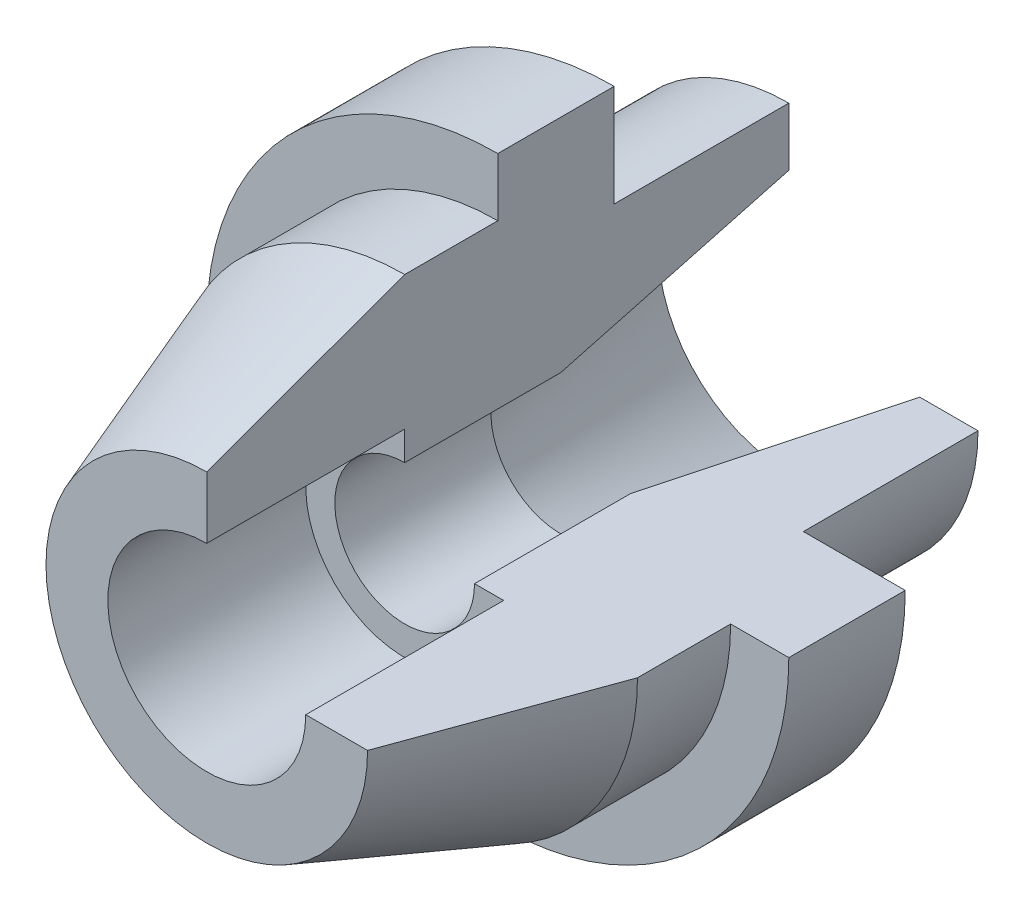
ISO-10303-21;
HEADER;
FILE_DESCRIPTION(('STEP AP214'),'2;1');
FILE_NAME('part.step','',(''),(''),'','','');
FILE_SCHEMA(('AUTOMOTIVE_DESIGN { 1 0 10303 214 1 1 1 1 }'));
ENDSEC;
DATA;
#1=APPLICATION_CONTEXT('core data for automotive mechanical design processes');
#2=APPLICATION_PROTOCOL_DEFINITION('international standard','automotive_design',2000,#1);
#3=PRODUCT_CONTEXT('',#1,'mechanical');
#4=PRODUCT('Part','Part','',(#3));
#5=PRODUCT_RELATED_PRODUCT_CATEGORY('part','',(#4));
#6=PRODUCT_DEFINITION_FORMATION('','',#4);
#7=PRODUCT_DEFINITION_CONTEXT('part definition',#1,'design');
#8=PRODUCT_DEFINITION('design','',#6,#7);
#9=PRODUCT_DEFINITION_SHAPE('','',#8);
#10=(LENGTH_UNIT() NAMED_UNIT(*) SI_UNIT(.MILLI.,.METRE.));
#11=(NAMED_UNIT(*) PLANE_ANGLE_UNIT() SI_UNIT($,.RADIAN.));
#12=(NAMED_UNIT(*) SI_UNIT($,.STERADIAN.) SOLID_ANGLE_UNIT());
#13=UNCERTAINTY_MEASURE_WITH_UNIT(LENGTH_MEASURE(1.E-05),#10,'distance_accuracy_value','');
#14=(GEOMETRIC_REPRESENTATION_CONTEXT(3) GLOBAL_UNCERTAINTY_ASSIGNED_CONTEXT((#13)) GLOBAL_UNIT_ASSIGNED_CONTEXT((#10,
#11,#12)) REPRESENTATION_CONTEXT('',''));
#15=CARTESIAN_POINT('',(0.,0.,0.));
#16=DIRECTION('',(0.,0.,1.));
#17=DIRECTION('',(1.,0.,0.));
#18=AXIS2_PLACEMENT_3D('',#15,#16,#17);
#19=CARTESIAN_POINT('',(0.,0.,0.));
#20=DIRECTION('',(0.,0.,-1.));
#21=DIRECTION('',(-1.,0.,0.));
#22=AXIS2_PLACEMENT_3D('',#19,#20,#21);
#23=CYLINDRICAL_SURFACE('',#22,17.);
#24=CARTESIAN_POINT('',(0.,0.,0.));
#25=DIRECTION('',(0.,0.,-1.));
#26=DIRECTION('',(-1.,0.,0.));
#27=AXIS2_PLACEMENT_3D('',#24,#25,#26);
#28=CIRCLE('',#27,17.);
#29=CARTESIAN_POINT('',(17.,1.78065548281E-13,0.));
#30=VERTEX_POINT('',#29);
#31=CARTESIAN_POINT('',(0.,17.,0.));
#32=VERTEX_POINT('',#31);
#33=EDGE_CURVE('E11',#30,#32,#28,.T.);
#34=ORIENTED_EDGE('',*,*,#33,.F.);
#35=DIRECTION('',(0.,0.,-1.));
#36=VECTOR('',#35,1.);
#37=CARTESIAN_POINT('',(17.,1.78065548281E-13,-34.));
#38=LINE('',#37,#36);
#39=CARTESIAN_POINT('',(17.,1.78065548281E-13,-34.));
#40=VERTEX_POINT('',#39);
#41=EDGE_CURVE('E128',#30,#40,#38,.T.);
#42=ORIENTED_EDGE('',*,*,#41,.T.);
#43=CARTESIAN_POINT('',(0.,0.,-34.));
#44=DIRECTION('',(0.,0.,-1.));
#45=DIRECTION('',(-1.,0.,0.));
#46=AXIS2_PLACEMENT_3D('',#43,#44,#45);
#47=CIRCLE('',#46,17.);
#48=CARTESIAN_POINT('',(0.,17.,-34.));
#49=VERTEX_POINT('',#48);
#50=EDGE_CURVE('E123',#40,#49,#47,.T.);
#51=ORIENTED_EDGE('',*,*,#50,.T.);
#52=DIRECTION('',(0.,0.,-1.));
#53=VECTOR('',#52,1.);
#54=CARTESIAN_POINT('',(0.,17.,-34.));
#55=LINE('',#54,#53);
#56=EDGE_CURVE('E126',#32,#49,#55,.T.);
#57=ORIENTED_EDGE('',*,*,#56,.F.);
#58=EDGE_LOOP('',(#34,#42,#51,#57));
#59=FACE_BOUND('',#58,.T.);
#60=ADVANCED_FACE('F39',(#59),#23,.F.);
#61=CARTESIAN_POINT('',(17.,1.78065548281E-13,0.));
#62=DIRECTION('',(0.,0.,1.));
#63=DIRECTION('',(1.,0.,0.));
#64=AXIS2_PLACEMENT_3D('',#61,#62,#63);
#65=PLANE('',#64);
#66=CARTESIAN_POINT('',(0.,0.,0.));
#67=DIRECTION('',(0.,0.,-1.));
#68=DIRECTION('',(-1.,0.,0.));
#69=AXIS2_PLACEMENT_3D('',#66,#67,#68);
#70=CIRCLE('',#69,27.6250120349492);
#71=CARTESIAN_POINT('',(27.6250120349492,2.89356642016027E-13,0.));
#72=VERTEX_POINT('',#71);
#73=CARTESIAN_POINT('',(0.,27.6250120349492,0.));
#74=VERTEX_POINT('',#73);
#75=EDGE_CURVE('E47',#72,#74,#70,.T.);
#76=ORIENTED_EDGE('',*,*,#75,.F.);
#77=DIRECTION('',(-1.,0.,0.));
#78=VECTOR('',#77,1.);
#79=CARTESIAN_POINT('',(17.,1.78065548281E-13,0.));
#80=LINE('',#79,#78);
#81=EDGE_CURVE('E133',#72,#30,#80,.T.);
#82=ORIENTED_EDGE('',*,*,#81,.T.);
#83=ORIENTED_EDGE('',*,*,#33,.T.);
#84=DIRECTION('',(0.,-1.,0.));
#85=VECTOR('',#84,1.);
#86=CARTESIAN_POINT('',(0.,17.,0.));
#87=LINE('',#86,#85);
#88=EDGE_CURVE('E146',#74,#32,#87,.T.);
#89=ORIENTED_EDGE('',*,*,#88,.F.);
#90=EDGE_LOOP('',(#76,#82,#83,#89));
#91=FACE_BOUND('',#90,.T.);
#92=ADVANCED_FACE('F41',(#91),#65,.T.);
#93=CARTESIAN_POINT('',(0.,0.,-34.));
#94=DIRECTION('',(0.,0.,-1.));
#95=DIRECTION('',(-1.,0.,0.));
#96=AXIS2_PLACEMENT_3D('',#93,#94,#95);
#97=CONICAL_SURFACE('',#96,40.,0.349065850398863);
#98=CARTESIAN_POINT('',(0.,0.,-34.));
#99=DIRECTION('',(0.,0.,-1.));
#100=DIRECTION('',(-1.,0.,0.));
#101=AXIS2_PLACEMENT_3D('',#98,#99,#100);
#102=CIRCLE('',#101,40.);
#103=CARTESIAN_POINT('',(40.,4.18977760661176E-13,-34.));
#104=VERTEX_POINT('',#103);
#105=CARTESIAN_POINT('',(0.,40.,-34.));
#106=VERTEX_POINT('',#105);
#107=EDGE_CURVE('E219',#104,#106,#102,.T.);
#108=ORIENTED_EDGE('',*,*,#107,.F.);
#109=DIRECTION('',(-0.342020143325666,0.,0.939692620785909));
#110=VECTOR('',#109,1.);
#111=CARTESIAN_POINT('',(27.6250120349492,2.89356642016027E-13,0.));
#112=LINE('',#111,#110);
#113=EDGE_CURVE('E201',#104,#72,#112,.T.);
#114=ORIENTED_EDGE('',*,*,#113,.T.);
#115=ORIENTED_EDGE('',*,*,#75,.T.);
#116=DIRECTION('',(0.,-0.342020143325666,0.939692620785909));
#117=VECTOR('',#116,1.);
#118=CARTESIAN_POINT('',(0.,27.6250120349492,0.));
#119=LINE('',#118,#117);
#120=EDGE_CURVE('E171',#106,#74,#119,.T.);
#121=ORIENTED_EDGE('',*,*,#120,.F.);
#122=EDGE_LOOP('',(#108,#114,#115,#121));
#123=FACE_BOUND('',#122,.T.);
#124=ADVANCED_FACE('F222',(#123),#97,.T.);
#125=CARTESIAN_POINT('',(0.,0.,0.));
#126=DIRECTION('',(0.,0.,-1.));
#127=DIRECTION('',(-1.,0.,0.));
#128=AXIS2_PLACEMENT_3D('',#125,#126,#127);
#129=CYLINDRICAL_SURFACE('',#128,40.);
#130=CARTESIAN_POINT('',(0.,0.,-50.));
#131=DIRECTION('',(0.,0.,-1.));
#132=DIRECTION('',(-1.,0.,0.));
#133=AXIS2_PLACEMENT_3D('',#130,#131,#132);
#134=CIRCLE('',#133,40.);
#135=CARTESIAN_POINT('',(40.,4.18977760661176E-13,-50.));
#136=VERTEX_POINT('',#135);
#137=CARTESIAN_POINT('',(0.,40.,-50.));
#138=VERTEX_POINT('',#137);
#139=EDGE_CURVE('E217',#136,#138,#134,.T.);
#140=ORIENTED_EDGE('',*,*,#139,.F.);
#141=DIRECTION('',(0.,0.,1.));
#142=VECTOR('',#141,1.);
#143=CARTESIAN_POINT('',(40.,4.18977760661176E-13,-34.));
#144=LINE('',#143,#142);
#145=EDGE_CURVE('E198',#136,#104,#144,.T.);
#146=ORIENTED_EDGE('',*,*,#145,.T.);
#147=ORIENTED_EDGE('',*,*,#107,.T.);
#148=DIRECTION('',(0.,0.,1.));
#149=VECTOR('',#148,1.);
#150=CARTESIAN_POINT('',(0.,40.,-34.));
#151=LINE('',#150,#149);
#152=EDGE_CURVE('E168',#138,#106,#151,.T.);
#153=ORIENTED_EDGE('',*,*,#152,.F.);
#154=EDGE_LOOP('',(#140,#146,#147,#153));
#155=FACE_BOUND('',#154,.T.);
#156=ADVANCED_FACE('F257',(#155),#129,.T.);
#157=CARTESIAN_POINT('',(40.,4.18977760661176E-13,-50.));
#158=DIRECTION('',(0.,0.,1.));
#159=DIRECTION('',(1.,0.,0.));
#160=AXIS2_PLACEMENT_3D('',#157,#158,#159);
#161=PLANE('',#160);
#162=CARTESIAN_POINT('',(0.,0.,-50.));
#163=DIRECTION('',(0.,0.,-1.));
#164=DIRECTION('',(-1.,0.,0.));
#165=AXIS2_PLACEMENT_3D('',#162,#163,#164);
#166=CIRCLE('',#165,50.);
#167=CARTESIAN_POINT('',(50.,5.2372220082647E-13,-50.));
#168=VERTEX_POINT('',#167);
#169=CARTESIAN_POINT('',(0.,50.,-50.));
#170=VERTEX_POINT('',#169);
#171=EDGE_CURVE('E215',#168,#170,#166,.T.);
#172=ORIENTED_EDGE('',*,*,#171,.F.);
#173=DIRECTION('',(-1.,0.,0.));
#174=VECTOR('',#173,1.);
#175=CARTESIAN_POINT('',(40.,4.18977760661176E-13,-50.));
#176=LINE('',#175,#174);
#177=EDGE_CURVE('E195',#168,#136,#176,.T.);
#178=ORIENTED_EDGE('',*,*,#177,.T.);
#179=ORIENTED_EDGE('',*,*,#139,.T.);
#180=DIRECTION('',(0.,-1.,0.));
#181=VECTOR('',#180,1.);
#182=CARTESIAN_POINT('',(0.,40.,-50.));
#183=LINE('',#182,#181);
#184=EDGE_CURVE('E165',#170,#138,#183,.T.);
#185=ORIENTED_EDGE('',*,*,#184,.F.);
#186=EDGE_LOOP('',(#172,#178,#179,#185));
#187=FACE_BOUND('',#186,.T.);
#188=ADVANCED_FACE('F254',(#187),#161,.T.);
#189=CARTESIAN_POINT('',(0.,0.,0.));
#190=DIRECTION('',(0.,0.,-1.));
#191=DIRECTION('',(-1.,0.,0.));
#192=AXIS2_PLACEMENT_3D('',#189,#190,#191);
#193=CYLINDRICAL_SURFACE('',#192,50.);
#194=CARTESIAN_POINT('',(0.,0.,-70.));
#195=DIRECTION('',(0.,0.,-1.));
#196=DIRECTION('',(-1.,0.,0.));
#197=AXIS2_PLACEMENT_3D('',#194,#195,#196);
#198=CIRCLE('',#197,50.);
#199=CARTESIAN_POINT('',(50.,5.2372220082647E-13,-70.));
#200=VERTEX_POINT('',#199);
#201=CARTESIAN_POINT('',(0.,50.,-70.));
#202=VERTEX_POINT('',#201);
#203=EDGE_CURVE('E213',#200,#202,#198,.T.);
#204=ORIENTED_EDGE('',*,*,#203,.F.);
#205=DIRECTION('',(0.,0.,1.));
#206=VECTOR('',#205,1.);
#207=CARTESIAN_POINT('',(50.,5.2372220082647E-13,-50.));
#208=LINE('',#207,#206);
#209=EDGE_CURVE('E192',#200,#168,#208,.T.);
#210=ORIENTED_EDGE('',*,*,#209,.T.);
#211=ORIENTED_EDGE('',*,*,#171,.T.);
#212=DIRECTION('',(0.,0.,1.));
#213=VECTOR('',#212,1.);
#214=CARTESIAN_POINT('',(0.,50.,-50.));
#215=LINE('',#214,#213);
#216=EDGE_CURVE('E162',#202,#170,#215,.T.);
#217=ORIENTED_EDGE('',*,*,#216,.F.);
#218=EDGE_LOOP('',(#204,#210,#211,#217));
#219=FACE_BOUND('',#218,.T.);
#220=ADVANCED_FACE('F251',(#219),#193,.T.);
#221=CARTESIAN_POINT('',(50.,5.2372220082647E-13,-70.));
#222=DIRECTION('',(0.,0.,-1.));
#223=DIRECTION('',(-1.,0.,0.));
#224=AXIS2_PLACEMENT_3D('',#221,#222,#223);
#225=PLANE('',#224);
#226=CARTESIAN_POINT('',(0.,0.,-70.));
#227=DIRECTION('',(0.,0.,-1.));
#228=DIRECTION('',(-1.,0.,0.));
#229=AXIS2_PLACEMENT_3D('',#226,#227,#228);
#230=CIRCLE('',#229,32.5);
#231=CARTESIAN_POINT('',(32.5,3.40419430537206E-13,-70.));
#232=VERTEX_POINT('',#231);
#233=CARTESIAN_POINT('',(0.,32.5,-70.));
#234=VERTEX_POINT('',#233);
#235=EDGE_CURVE('E211',#232,#234,#230,.T.);
#236=ORIENTED_EDGE('',*,*,#235,.F.);
#237=DIRECTION('',(1.,0.,0.));
#238=VECTOR('',#237,1.);
#239=CARTESIAN_POINT('',(50.,5.2372220082647E-13,-70.));
#240=LINE('',#239,#238);
#241=EDGE_CURVE('E189',#232,#200,#240,.T.);
#242=ORIENTED_EDGE('',*,*,#241,.T.);
#243=ORIENTED_EDGE('',*,*,#203,.T.);
#244=DIRECTION('',(0.,1.,0.));
#245=VECTOR('',#244,1.);
#246=CARTESIAN_POINT('',(0.,50.,-70.));
#247=LINE('',#246,#245);
#248=EDGE_CURVE('E159',#234,#202,#247,.T.);
#249=ORIENTED_EDGE('',*,*,#248,.F.);
#250=EDGE_LOOP('',(#236,#242,#243,#249));
#251=FACE_BOUND('',#250,.T.);
#252=ADVANCED_FACE('F246',(#251),#225,.T.);
#253=CARTESIAN_POINT('',(0.,0.,0.));
#254=DIRECTION('',(0.,0.,-1.));
#255=DIRECTION('',(-1.,0.,0.));
#256=AXIS2_PLACEMENT_3D('',#253,#254,#255);
#257=CYLINDRICAL_SURFACE('',#256,32.5);
#258=CARTESIAN_POINT('',(0.,0.,-100.));
#259=DIRECTION('',(0.,0.,-1.));
#260=DIRECTION('',(-1.,0.,0.));
#261=AXIS2_PLACEMENT_3D('',#258,#259,#260);
#262=CIRCLE('',#261,32.5);
#263=CARTESIAN_POINT('',(32.5,3.40419430537206E-13,-100.));
#264=VERTEX_POINT('',#263);
#265=CARTESIAN_POINT('',(0.,32.5,-100.));
#266=VERTEX_POINT('',#265);
#267=EDGE_CURVE('E209',#264,#266,#262,.T.);
#268=ORIENTED_EDGE('',*,*,#267,.F.);
#269=DIRECTION('',(0.,0.,1.));
#270=VECTOR('',#269,1.);
#271=CARTESIAN_POINT('',(32.5,3.40419430537206E-13,-70.));
#272=LINE('',#271,#270);
#273=EDGE_CURVE('E186',#264,#232,#272,.T.);
#274=ORIENTED_EDGE('',*,*,#273,.T.);
#275=ORIENTED_EDGE('',*,*,#235,.T.);
#276=DIRECTION('',(0.,0.,1.));
#277=VECTOR('',#276,1.);
#278=CARTESIAN_POINT('',(0.,32.5,-70.));
#279=LINE('',#278,#277);
#280=EDGE_CURVE('E156',#266,#234,#279,.T.);
#281=ORIENTED_EDGE('',*,*,#280,.F.);
#282=EDGE_LOOP('',(#268,#274,#275,#281));
#283=FACE_BOUND('',#282,.T.);
#284=ADVANCED_FACE('F243',(#283),#257,.T.);
#285=CARTESIAN_POINT('',(32.5,3.40419430537206E-13,-100.));
#286=DIRECTION('',(0.,0.,-1.));
#287=DIRECTION('',(-1.,0.,0.));
#288=AXIS2_PLACEMENT_3D('',#285,#286,#287);
#289=PLANE('',#288);
#290=CARTESIAN_POINT('',(0.,0.,-100.));
#291=DIRECTION('',(0.,0.,-1.));
#292=DIRECTION('',(-1.,0.,0.));
#293=AXIS2_PLACEMENT_3D('',#290,#291,#292);
#294=CIRCLE('',#293,22.5);
#295=CARTESIAN_POINT('',(22.5,2.35674990371912E-13,-100.));
#296=VERTEX_POINT('',#295);
#297=CARTESIAN_POINT('',(0.,22.5,-100.));
#298=VERTEX_POINT('',#297);
#299=EDGE_CURVE('E207',#296,#298,#294,.T.);
#300=ORIENTED_EDGE('',*,*,#299,.F.);
#301=DIRECTION('',(1.,0.,0.));
#302=VECTOR('',#301,1.);
#303=CARTESIAN_POINT('',(32.5,3.40419430537206E-13,-100.));
#304=LINE('',#303,#302);
#305=EDGE_CURVE('E183',#296,#264,#304,.T.);
#306=ORIENTED_EDGE('',*,*,#305,.T.);
#307=ORIENTED_EDGE('',*,*,#267,.T.);
#308=DIRECTION('',(0.,1.,0.));
#309=VECTOR('',#308,1.);
#310=CARTESIAN_POINT('',(0.,32.5,-100.));
#311=LINE('',#310,#309);
#312=EDGE_CURVE('E153',#298,#266,#311,.T.);
#313=ORIENTED_EDGE('',*,*,#312,.F.);
#314=EDGE_LOOP('',(#300,#306,#307,#313));
#315=FACE_BOUND('',#314,.T.);
#316=ADVANCED_FACE('F238',(#315),#289,.T.);
#317=CARTESIAN_POINT('',(0.,0.,-60.8134665205258));
#318=DIRECTION('',(0.,0.,-1.));
#319=DIRECTION('',(-1.,0.,0.));
#320=AXIS2_PLACEMENT_3D('',#317,#318,#319);
#321=CONICAL_SURFACE('',#320,12.,0.261799387799143);
#322=CARTESIAN_POINT('',(0.,0.,-60.8134665205258));
#323=DIRECTION('',(0.,0.,-1.));
#324=DIRECTION('',(-1.,0.,0.));
#325=AXIS2_PLACEMENT_3D('',#322,#323,#324);
#326=CIRCLE('',#325,12.);
#327=CARTESIAN_POINT('',(12.,1.25693328198353E-13,-60.8134665205258));
#328=VERTEX_POINT('',#327);
#329=CARTESIAN_POINT('',(0.,12.,-60.8134665205258));
#330=VERTEX_POINT('',#329);
#331=EDGE_CURVE('E205',#328,#330,#326,.T.);
#332=ORIENTED_EDGE('',*,*,#331,.F.);
#333=DIRECTION('',(0.258819045102515,0.,-0.96592582628907));
#334=VECTOR('',#333,1.);
#335=CARTESIAN_POINT('',(22.5,2.35674990371912E-13,-100.));
#336=LINE('',#335,#334);
#337=EDGE_CURVE('E180',#328,#296,#336,.T.);
#338=ORIENTED_EDGE('',*,*,#337,.T.);
#339=ORIENTED_EDGE('',*,*,#299,.T.);
#340=DIRECTION('',(0.,0.258819045102515,-0.96592582628907));
#341=VECTOR('',#340,1.);
#342=CARTESIAN_POINT('',(0.,22.5,-100.));
#343=LINE('',#342,#341);
#344=EDGE_CURVE('E150',#330,#298,#343,.T.);
#345=ORIENTED_EDGE('',*,*,#344,.F.);
#346=EDGE_LOOP('',(#332,#338,#339,#345));
#347=FACE_BOUND('',#346,.T.);
#348=ADVANCED_FACE('F236',(#347),#321,.F.);
#349=CARTESIAN_POINT('',(0.,0.,0.));
#350=DIRECTION('',(0.,0.,-1.));
#351=DIRECTION('',(-1.,0.,0.));
#352=AXIS2_PLACEMENT_3D('',#349,#350,#351);
#353=CYLINDRICAL_SURFACE('',#352,12.);
#354=CARTESIAN_POINT('',(0.,0.,-34.));
#355=DIRECTION('',(0.,0.,-1.));
#356=DIRECTION('',(-1.,0.,0.));
#357=AXIS2_PLACEMENT_3D('',#354,#355,#356);
#358=CIRCLE('',#357,12.);
#359=CARTESIAN_POINT('',(12.,1.25693328198353E-13,-34.));
#360=VERTEX_POINT('',#359);
#361=CARTESIAN_POINT('',(0.,12.,-34.));
#362=VERTEX_POINT('',#361);
#363=EDGE_CURVE('E132',#360,#362,#358,.T.);
#364=ORIENTED_EDGE('',*,*,#363,.F.);
#365=DIRECTION('',(0.,0.,-1.));
#366=VECTOR('',#365,1.);
#367=CARTESIAN_POINT('',(12.,1.25693328198353E-13,-60.8134665205258));
#368=LINE('',#367,#366);
#369=EDGE_CURVE('E177',#360,#328,#368,.T.);
#370=ORIENTED_EDGE('',*,*,#369,.T.);
#371=ORIENTED_EDGE('',*,*,#331,.T.);
#372=DIRECTION('',(0.,0.,-1.));
#373=VECTOR('',#372,1.);
#374=CARTESIAN_POINT('',(0.,12.,-60.8134665205258));
#375=LINE('',#374,#373);
#376=EDGE_CURVE('E141',#362,#330,#375,.T.);
#377=ORIENTED_EDGE('',*,*,#376,.F.);
#378=EDGE_LOOP('',(#364,#370,#371,#377));
#379=FACE_BOUND('',#378,.T.);
#380=ADVANCED_FACE('F232',(#379),#353,.F.);
#381=CARTESIAN_POINT('',(12.,1.25693328198353E-13,-34.));
#382=DIRECTION('',(0.,0.,1.));
#383=DIRECTION('',(1.,0.,0.));
#384=AXIS2_PLACEMENT_3D('',#381,#382,#383);
#385=PLANE('',#384);
#386=DIRECTION('',(-1.,0.,0.));
#387=VECTOR('',#386,1.);
#388=CARTESIAN_POINT('',(12.,1.25693328198353E-13,-34.));
#389=LINE('',#388,#387);
#390=EDGE_CURVE('E175',#40,#360,#389,.T.);
#391=ORIENTED_EDGE('',*,*,#390,.T.);
#392=ORIENTED_EDGE('',*,*,#363,.T.);
#393=DIRECTION('',(0.,-1.,0.));
#394=VECTOR('',#393,1.);
#395=CARTESIAN_POINT('',(0.,12.,-34.));
#396=LINE('',#395,#394);
#397=EDGE_CURVE('E136',#49,#362,#396,.T.);
#398=ORIENTED_EDGE('',*,*,#397,.F.);
#399=ORIENTED_EDGE('',*,*,#50,.F.);
#400=EDGE_LOOP('',(#391,#392,#398,#399));
#401=FACE_BOUND('',#400,.T.);
#402=ADVANCED_FACE('F137',(#401),#385,.T.);
#403=CARTESIAN_POINT('',(0.,0.,0.));
#404=DIRECTION('',(0.,1.,0.));
#405=DIRECTION('',(0.,0.,1.));
#406=AXIS2_PLACEMENT_3D('',#403,#404,#405);
#407=PLANE('',#406);
#408=ORIENTED_EDGE('',*,*,#41,.F.);
#409=ORIENTED_EDGE('',*,*,#81,.F.);
#410=ORIENTED_EDGE('',*,*,#113,.F.);
#411=ORIENTED_EDGE('',*,*,#145,.F.);
#412=ORIENTED_EDGE('',*,*,#177,.F.);
#413=ORIENTED_EDGE('',*,*,#209,.F.);
#414=ORIENTED_EDGE('',*,*,#241,.F.);
#415=ORIENTED_EDGE('',*,*,#273,.F.);
#416=ORIENTED_EDGE('',*,*,#305,.F.);
#417=ORIENTED_EDGE('',*,*,#337,.F.);
#418=ORIENTED_EDGE('',*,*,#369,.F.);
#419=ORIENTED_EDGE('',*,*,#390,.F.);
#420=EDGE_LOOP('',(#408,#409,#410,#411,#412,#413,#414,#415,#416,#417,#418,#419));
#421=FACE_BOUND('',#420,.T.);
#422=ADVANCED_FACE('F227',(#421),#407,.T.);
#423=CARTESIAN_POINT('',(0.,0.,0.));
#424=DIRECTION('',(-1.,0.,0.));
#425=DIRECTION('',(0.,0.,1.));
#426=AXIS2_PLACEMENT_3D('',#423,#424,#425);
#427=PLANE('',#426);
#428=ORIENTED_EDGE('',*,*,#56,.T.);
#429=ORIENTED_EDGE('',*,*,#397,.T.);
#430=ORIENTED_EDGE('',*,*,#376,.T.);
#431=ORIENTED_EDGE('',*,*,#344,.T.);
#432=ORIENTED_EDGE('',*,*,#312,.T.);
#433=ORIENTED_EDGE('',*,*,#280,.T.);
#434=ORIENTED_EDGE('',*,*,#248,.T.);
#435=ORIENTED_EDGE('',*,*,#216,.T.);
#436=ORIENTED_EDGE('',*,*,#184,.T.);
#437=ORIENTED_EDGE('',*,*,#152,.T.);
#438=ORIENTED_EDGE('',*,*,#120,.T.);
#439=ORIENTED_EDGE('',*,*,#88,.T.);
#440=EDGE_LOOP('',(#428,#429,#430,#431,#432,#433,#434,#435,#436,#437,#438,#439));
#441=FACE_BOUND('',#440,.T.);
#442=ADVANCED_FACE('F144',(#441),#427,.F.);
#443=CLOSED_SHELL('',(#60,#92,#124,#156,#188,#220,#252,#284,#316,#348,#380,#402,#422,#442));
#444=MANIFOLD_SOLID_BREP('B2',#443);
#445=ADVANCED_BREP_SHAPE_REPRESENTATION('',(#18,#444),#14);
#446=SHAPE_DEFINITION_REPRESENTATION(#9,#445);
ENDSEC;
END-ISO-10303-21;
